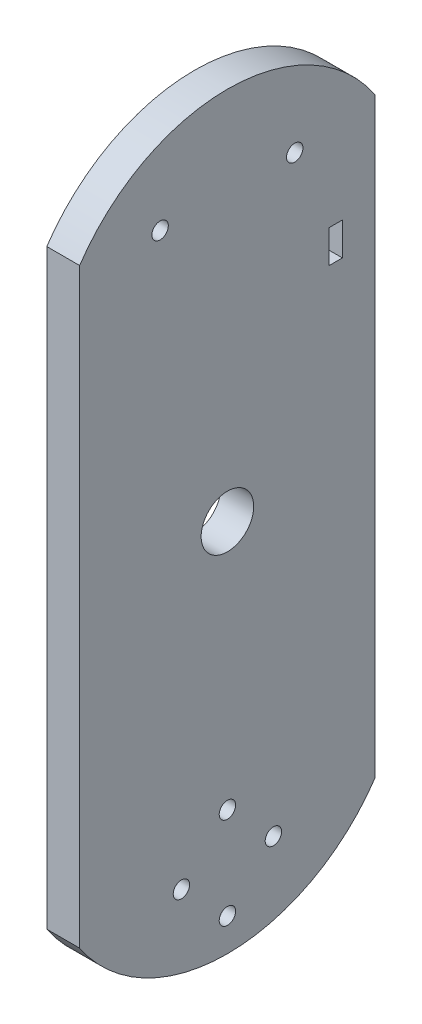
ISO-10303-21;
HEADER;
FILE_DESCRIPTION(('STEP AP214'),'2;1');
FILE_NAME('part.step','',(''),(''),'','','');
FILE_SCHEMA(('AUTOMOTIVE_DESIGN { 1 0 10303 214 1 1 1 1 }'));
ENDSEC;
DATA;
#1=APPLICATION_CONTEXT('core data for automotive mechanical design processes');
#2=APPLICATION_PROTOCOL_DEFINITION('international standard','automotive_design',2000,#1);
#3=PRODUCT_CONTEXT('',#1,'mechanical');
#4=PRODUCT('Part','Part','',(#3));
#5=PRODUCT_RELATED_PRODUCT_CATEGORY('part','',(#4));
#6=PRODUCT_DEFINITION_FORMATION('','',#4);
#7=PRODUCT_DEFINITION_CONTEXT('part definition',#1,'design');
#8=PRODUCT_DEFINITION('design','',#6,#7);
#9=PRODUCT_DEFINITION_SHAPE('','',#8);
#10=(LENGTH_UNIT() NAMED_UNIT(*) SI_UNIT(.MILLI.,.METRE.));
#11=(NAMED_UNIT(*) PLANE_ANGLE_UNIT() SI_UNIT($,.RADIAN.));
#12=(NAMED_UNIT(*) SI_UNIT($,.STERADIAN.) SOLID_ANGLE_UNIT());
#13=UNCERTAINTY_MEASURE_WITH_UNIT(LENGTH_MEASURE(1.E-05),#10,'distance_accuracy_value','');
#14=(GEOMETRIC_REPRESENTATION_CONTEXT(3) GLOBAL_UNCERTAINTY_ASSIGNED_CONTEXT((#13)) GLOBAL_UNIT_ASSIGNED_CONTEXT((#10,
#11,#12)) REPRESENTATION_CONTEXT('',''));
#15=CARTESIAN_POINT('',(0.,0.,0.));
#16=DIRECTION('',(0.,0.,1.));
#17=DIRECTION('',(1.,0.,0.));
#18=AXIS2_PLACEMENT_3D('',#15,#16,#17);
#19=CARTESIAN_POINT('',(5.,15.09375,0.));
#20=DIRECTION('',(1.,0.,0.));
#21=DIRECTION('',(0.,0.,-1.));
#22=AXIS2_PLACEMENT_3D('',#19,#20,#21);
#23=PLANE('',#22);
#24=CARTESIAN_POINT('',(5.,88.5,-10.25));
#25=DIRECTION('',(1.,0.,0.));
#26=DIRECTION('',(0.,0.,-1.));
#27=AXIS2_PLACEMENT_3D('',#24,#25,#26);
#28=CIRCLE('',#27,1.25);
#29=CARTESIAN_POINT('',(5.,88.5,-11.5));
#30=VERTEX_POINT('',#29);
#31=EDGE_CURVE('E169',#30,#30,#28,.T.);
#32=ORIENTED_EDGE('',*,*,#31,.F.);
#33=EDGE_LOOP('',(#32));
#34=FACE_BOUND('',#33,.T.);
#35=CARTESIAN_POINT('',(5.,0.,7.));
#36=DIRECTION('',(1.,0.,0.));
#37=DIRECTION('',(0.,0.,-1.));
#38=AXIS2_PLACEMENT_3D('',#35,#36,#37);
#39=CIRCLE('',#38,1.25);
#40=CARTESIAN_POINT('',(5.,0.,5.75));
#41=VERTEX_POINT('',#40);
#42=EDGE_CURVE('E185',#41,#41,#39,.T.);
#43=ORIENTED_EDGE('',*,*,#42,.F.);
#44=EDGE_LOOP('',(#43));
#45=FACE_BOUND('',#44,.T.);
#46=CARTESIAN_POINT('',(5.,0.,-7.));
#47=DIRECTION('',(1.,0.,0.));
#48=DIRECTION('',(0.,0.,-1.));
#49=AXIS2_PLACEMENT_3D('',#46,#47,#48);
#50=CIRCLE('',#49,1.25);
#51=CARTESIAN_POINT('',(5.,0.,-8.25));
#52=VERTEX_POINT('',#51);
#53=EDGE_CURVE('E201',#52,#52,#50,.T.);
#54=ORIENTED_EDGE('',*,*,#53,.F.);
#55=EDGE_LOOP('',(#54));
#56=FACE_BOUND('',#55,.T.);
#57=CARTESIAN_POINT('',(5.,15.09375,0.));
#58=DIRECTION('',(1.,0.,0.));
#59=DIRECTION('',(0.,0.,-1.));
#60=AXIS2_PLACEMENT_3D('',#57,#58,#59);
#61=CIRCLE('',#60,27.09375);
#62=CARTESIAN_POINT('',(5.,0.,22.5));
#63=VERTEX_POINT('',#62);
#64=CARTESIAN_POINT('',(5.,0.,-22.5));
#65=VERTEX_POINT('',#64);
#66=EDGE_CURVE('E217',#63,#65,#61,.T.);
#67=ORIENTED_EDGE('',*,*,#66,.T.);
#68=DIRECTION('',(0.,1.,0.));
#69=VECTOR('',#68,1.);
#70=CARTESIAN_POINT('',(5.,0.,-22.5));
#71=LINE('',#70,#69);
#72=CARTESIAN_POINT('',(5.,90.,-22.5));
#73=VERTEX_POINT('',#72);
#74=EDGE_CURVE('E221',#65,#73,#71,.T.);
#75=ORIENTED_EDGE('',*,*,#74,.T.);
#76=CARTESIAN_POINT('',(5.,74.90625,0.));
#77=DIRECTION('',(1.,0.,0.));
#78=DIRECTION('',(0.,0.,1.));
#79=AXIS2_PLACEMENT_3D('',#76,#77,#78);
#80=CIRCLE('',#79,27.09375);
#81=CARTESIAN_POINT('',(5.,90.,22.5));
#82=VERTEX_POINT('',#81);
#83=EDGE_CURVE('E225',#73,#82,#80,.T.);
#84=ORIENTED_EDGE('',*,*,#83,.T.);
#85=DIRECTION('',(0.,-1.,0.));
#86=VECTOR('',#85,1.);
#87=CARTESIAN_POINT('',(5.,0.,22.5));
#88=LINE('',#87,#86);
#89=EDGE_CURVE('E228',#82,#63,#88,.T.);
#90=ORIENTED_EDGE('',*,*,#89,.T.);
#91=EDGE_LOOP('',(#67,#75,#84,#90));
#92=FACE_BOUND('',#91,.T.);
#93=CARTESIAN_POINT('',(5.,7.,0.));
#94=DIRECTION('',(1.,0.,0.));
#95=DIRECTION('',(0.,0.,-1.));
#96=AXIS2_PLACEMENT_3D('',#93,#94,#95);
#97=CIRCLE('',#96,1.25);
#98=CARTESIAN_POINT('',(5.,7.,-1.25));
#99=VERTEX_POINT('',#98);
#100=EDGE_CURVE('E209',#99,#99,#97,.T.);
#101=ORIENTED_EDGE('',*,*,#100,.F.);
#102=EDGE_LOOP('',(#101));
#103=FACE_BOUND('',#102,.T.);
#104=CARTESIAN_POINT('',(5.,-7.,0.));
#105=DIRECTION('',(1.,0.,0.));
#106=DIRECTION('',(0.,0.,-1.));
#107=AXIS2_PLACEMENT_3D('',#104,#105,#106);
#108=CIRCLE('',#107,1.25);
#109=CARTESIAN_POINT('',(5.,-7.,-1.25));
#110=VERTEX_POINT('',#109);
#111=EDGE_CURVE('E193',#110,#110,#108,.T.);
#112=ORIENTED_EDGE('',*,*,#111,.F.);
#113=EDGE_LOOP('',(#112));
#114=FACE_BOUND('',#113,.T.);
#115=CARTESIAN_POINT('',(5.,88.5,10.25));
#116=DIRECTION('',(1.,0.,0.));
#117=DIRECTION('',(0.,0.,-1.));
#118=AXIS2_PLACEMENT_3D('',#115,#116,#117);
#119=CIRCLE('',#118,1.25);
#120=CARTESIAN_POINT('',(5.,88.5,9.00000000000001));
#121=VERTEX_POINT('',#120);
#122=EDGE_CURVE('E177',#121,#121,#119,.T.);
#123=ORIENTED_EDGE('',*,*,#122,.F.);
#124=EDGE_LOOP('',(#123));
#125=FACE_BOUND('',#124,.T.);
#126=CARTESIAN_POINT('',(5.,45.,0.));
#127=DIRECTION('',(1.,0.,0.));
#128=DIRECTION('',(0.,0.,-1.));
#129=AXIS2_PLACEMENT_3D('',#126,#127,#128);
#130=CIRCLE('',#129,4.);
#131=CARTESIAN_POINT('',(5.,45.,-4.));
#132=VERTEX_POINT('',#131);
#133=EDGE_CURVE('E161',#132,#132,#130,.T.);
#134=ORIENTED_EDGE('',*,*,#133,.F.);
#135=EDGE_LOOP('',(#134));
#136=FACE_BOUND('',#135,.T.);
#137=DIRECTION('',(0.,0.,-1.));
#138=VECTOR('',#137,1.);
#139=CARTESIAN_POINT('',(5.,71.,-15.5));
#140=LINE('',#139,#138);
#141=CARTESIAN_POINT('',(5.,71.,-15.5));
#142=VERTEX_POINT('',#141);
#143=CARTESIAN_POINT('',(5.,71.,-17.5));
#144=VERTEX_POINT('',#143);
#145=EDGE_CURVE('E120',#142,#144,#140,.T.);
#146=ORIENTED_EDGE('',*,*,#145,.F.);
#147=DIRECTION('',(0.,-1.,0.));
#148=VECTOR('',#147,1.);
#149=CARTESIAN_POINT('',(5.,76.,-15.5));
#150=LINE('',#149,#148);
#151=CARTESIAN_POINT('',(5.,76.,-15.5));
#152=VERTEX_POINT('',#151);
#153=EDGE_CURVE('E111',#152,#142,#150,.T.);
#154=ORIENTED_EDGE('',*,*,#153,.F.);
#155=DIRECTION('',(0.,0.,1.));
#156=VECTOR('',#155,1.);
#157=CARTESIAN_POINT('',(5.,76.,-15.5));
#158=LINE('',#157,#156);
#159=CARTESIAN_POINT('',(5.,76.,-17.5));
#160=VERTEX_POINT('',#159);
#161=EDGE_CURVE('E139',#160,#152,#158,.T.);
#162=ORIENTED_EDGE('',*,*,#161,.F.);
#163=DIRECTION('',(0.,1.,0.));
#164=VECTOR('',#163,1.);
#165=CARTESIAN_POINT('',(5.,76.,-17.5));
#166=LINE('',#165,#164);
#167=EDGE_CURVE('E133',#144,#160,#166,.T.);
#168=ORIENTED_EDGE('',*,*,#167,.F.);
#169=EDGE_LOOP('',(#146,#154,#162,#168));
#170=FACE_BOUND('',#169,.T.);
#171=ADVANCED_FACE('F45',(#34,#45,#56,#92,#103,#114,#125,#136,#170),#23,.T.);
#172=CARTESIAN_POINT('',(0.,15.09375,0.));
#173=DIRECTION('',(1.,0.,0.));
#174=DIRECTION('',(0.,0.,-1.));
#175=AXIS2_PLACEMENT_3D('',#172,#173,#174);
#176=PLANE('',#175);
#177=CARTESIAN_POINT('',(0.,45.,0.));
#178=DIRECTION('',(1.,0.,0.));
#179=DIRECTION('',(0.,0.,-1.));
#180=AXIS2_PLACEMENT_3D('',#177,#178,#179);
#181=CIRCLE('',#180,4.);
#182=CARTESIAN_POINT('',(0.,45.,-4.));
#183=VERTEX_POINT('',#182);
#184=EDGE_CURVE('E129',#183,#183,#181,.T.);
#185=ORIENTED_EDGE('',*,*,#184,.T.);
#186=EDGE_LOOP('',(#185));
#187=FACE_BOUND('',#186,.T.);
#188=CARTESIAN_POINT('',(0.,88.5,-10.25));
#189=DIRECTION('',(1.,0.,0.));
#190=DIRECTION('',(0.,0.,-1.));
#191=AXIS2_PLACEMENT_3D('',#188,#189,#190);
#192=CIRCLE('',#191,1.25);
#193=CARTESIAN_POINT('',(0.,88.5,-11.5));
#194=VERTEX_POINT('',#193);
#195=EDGE_CURVE('E165',#194,#194,#192,.T.);
#196=ORIENTED_EDGE('',*,*,#195,.T.);
#197=EDGE_LOOP('',(#196));
#198=FACE_BOUND('',#197,.T.);
#199=CARTESIAN_POINT('',(0.,88.5,10.25));
#200=DIRECTION('',(1.,0.,0.));
#201=DIRECTION('',(0.,0.,-1.));
#202=AXIS2_PLACEMENT_3D('',#199,#200,#201);
#203=CIRCLE('',#202,1.25);
#204=CARTESIAN_POINT('',(0.,88.5,9.00000000000001));
#205=VERTEX_POINT('',#204);
#206=EDGE_CURVE('E173',#205,#205,#203,.T.);
#207=ORIENTED_EDGE('',*,*,#206,.T.);
#208=EDGE_LOOP('',(#207));
#209=FACE_BOUND('',#208,.T.);
#210=CARTESIAN_POINT('',(0.,0.,7.));
#211=DIRECTION('',(1.,0.,0.));
#212=DIRECTION('',(0.,0.,-1.));
#213=AXIS2_PLACEMENT_3D('',#210,#211,#212);
#214=CIRCLE('',#213,1.25);
#215=CARTESIAN_POINT('',(0.,0.,5.75));
#216=VERTEX_POINT('',#215);
#217=EDGE_CURVE('E181',#216,#216,#214,.T.);
#218=ORIENTED_EDGE('',*,*,#217,.T.);
#219=EDGE_LOOP('',(#218));
#220=FACE_BOUND('',#219,.T.);
#221=CARTESIAN_POINT('',(0.,-7.,0.));
#222=DIRECTION('',(1.,0.,0.));
#223=DIRECTION('',(0.,0.,-1.));
#224=AXIS2_PLACEMENT_3D('',#221,#222,#223);
#225=CIRCLE('',#224,1.25);
#226=CARTESIAN_POINT('',(0.,-7.,-1.25));
#227=VERTEX_POINT('',#226);
#228=EDGE_CURVE('E189',#227,#227,#225,.T.);
#229=ORIENTED_EDGE('',*,*,#228,.T.);
#230=EDGE_LOOP('',(#229));
#231=FACE_BOUND('',#230,.T.);
#232=CARTESIAN_POINT('',(0.,0.,-7.));
#233=DIRECTION('',(1.,0.,0.));
#234=DIRECTION('',(0.,0.,-1.));
#235=AXIS2_PLACEMENT_3D('',#232,#233,#234);
#236=CIRCLE('',#235,1.25);
#237=CARTESIAN_POINT('',(0.,0.,-8.25));
#238=VERTEX_POINT('',#237);
#239=EDGE_CURVE('E197',#238,#238,#236,.T.);
#240=ORIENTED_EDGE('',*,*,#239,.T.);
#241=EDGE_LOOP('',(#240));
#242=FACE_BOUND('',#241,.T.);
#243=CARTESIAN_POINT('',(0.,7.,0.));
#244=DIRECTION('',(1.,0.,0.));
#245=DIRECTION('',(0.,0.,-1.));
#246=AXIS2_PLACEMENT_3D('',#243,#244,#245);
#247=CIRCLE('',#246,1.25);
#248=CARTESIAN_POINT('',(0.,7.,-1.25));
#249=VERTEX_POINT('',#248);
#250=EDGE_CURVE('E205',#249,#249,#247,.T.);
#251=ORIENTED_EDGE('',*,*,#250,.T.);
#252=EDGE_LOOP('',(#251));
#253=FACE_BOUND('',#252,.T.);
#254=CARTESIAN_POINT('',(0.,15.09375,0.));
#255=DIRECTION('',(1.,0.,0.));
#256=DIRECTION('',(0.,0.,-1.));
#257=AXIS2_PLACEMENT_3D('',#254,#255,#256);
#258=CIRCLE('',#257,27.09375);
#259=CARTESIAN_POINT('',(0.,0.,22.5));
#260=VERTEX_POINT('',#259);
#261=CARTESIAN_POINT('',(0.,0.,-22.5));
#262=VERTEX_POINT('',#261);
#263=EDGE_CURVE('E213',#260,#262,#258,.T.);
#264=ORIENTED_EDGE('',*,*,#263,.F.);
#265=DIRECTION('',(0.,-1.,0.));
#266=VECTOR('',#265,1.);
#267=CARTESIAN_POINT('',(0.,0.,22.5));
#268=LINE('',#267,#266);
#269=CARTESIAN_POINT('',(0.,90.,22.5));
#270=VERTEX_POINT('',#269);
#271=EDGE_CURVE('E222',#270,#260,#268,.T.);
#272=ORIENTED_EDGE('',*,*,#271,.F.);
#273=CARTESIAN_POINT('',(0.,74.90625,0.));
#274=DIRECTION('',(1.,0.,0.));
#275=DIRECTION('',(0.,0.,1.));
#276=AXIS2_PLACEMENT_3D('',#273,#274,#275);
#277=CIRCLE('',#276,27.09375);
#278=CARTESIAN_POINT('',(0.,90.,-22.5));
#279=VERTEX_POINT('',#278);
#280=EDGE_CURVE('E238',#279,#270,#277,.T.);
#281=ORIENTED_EDGE('',*,*,#280,.F.);
#282=DIRECTION('',(0.,1.,0.));
#283=VECTOR('',#282,1.);
#284=CARTESIAN_POINT('',(0.,0.,-22.5));
#285=LINE('',#284,#283);
#286=EDGE_CURVE('E235',#262,#279,#285,.T.);
#287=ORIENTED_EDGE('',*,*,#286,.F.);
#288=EDGE_LOOP('',(#264,#272,#281,#287));
#289=FACE_BOUND('',#288,.T.);
#290=DIRECTION('',(0.,-1.,0.));
#291=VECTOR('',#290,1.);
#292=CARTESIAN_POINT('',(0.,76.,-15.5));
#293=LINE('',#292,#291);
#294=CARTESIAN_POINT('',(0.,76.,-15.5));
#295=VERTEX_POINT('',#294);
#296=CARTESIAN_POINT('',(0.,71.,-15.5));
#297=VERTEX_POINT('',#296);
#298=EDGE_CURVE('E69',#295,#297,#293,.T.);
#299=ORIENTED_EDGE('',*,*,#298,.T.);
#300=DIRECTION('',(0.,0.,-1.));
#301=VECTOR('',#300,1.);
#302=CARTESIAN_POINT('',(0.,71.,-15.5));
#303=LINE('',#302,#301);
#304=CARTESIAN_POINT('',(0.,71.,-17.5));
#305=VERTEX_POINT('',#304);
#306=EDGE_CURVE('E127',#297,#305,#303,.T.);
#307=ORIENTED_EDGE('',*,*,#306,.T.);
#308=DIRECTION('',(0.,1.,0.));
#309=VECTOR('',#308,1.);
#310=CARTESIAN_POINT('',(0.,76.,-17.5));
#311=LINE('',#310,#309);
#312=CARTESIAN_POINT('',(0.,76.,-17.5));
#313=VERTEX_POINT('',#312);
#314=EDGE_CURVE('E148',#305,#313,#311,.T.);
#315=ORIENTED_EDGE('',*,*,#314,.T.);
#316=DIRECTION('',(0.,0.,1.));
#317=VECTOR('',#316,1.);
#318=CARTESIAN_POINT('',(0.,76.,-15.5));
#319=LINE('',#318,#317);
#320=EDGE_CURVE('E121',#313,#295,#319,.T.);
#321=ORIENTED_EDGE('',*,*,#320,.T.);
#322=EDGE_LOOP('',(#299,#307,#315,#321));
#323=FACE_BOUND('',#322,.T.);
#324=ADVANCED_FACE('F263',(#187,#198,#209,#220,#231,#242,#253,#289,#323),#176,.F.);
#325=CARTESIAN_POINT('',(5.,15.09375,0.));
#326=DIRECTION('',(-1.,0.,0.));
#327=DIRECTION('',(0.,0.,1.));
#328=AXIS2_PLACEMENT_3D('',#325,#326,#327);
#329=CYLINDRICAL_SURFACE('',#328,27.09375);
#330=ORIENTED_EDGE('',*,*,#263,.T.);
#331=DIRECTION('',(-1.,0.,0.));
#332=VECTOR('',#331,1.);
#333=CARTESIAN_POINT('',(5.,0.,-22.5));
#334=LINE('',#333,#332);
#335=EDGE_CURVE('E11',#65,#262,#334,.T.);
#336=ORIENTED_EDGE('',*,*,#335,.F.);
#337=ORIENTED_EDGE('',*,*,#66,.F.);
#338=DIRECTION('',(-1.,0.,0.));
#339=VECTOR('',#338,1.);
#340=CARTESIAN_POINT('',(5.,0.,22.5));
#341=LINE('',#340,#339);
#342=EDGE_CURVE('E231',#63,#260,#341,.T.);
#343=ORIENTED_EDGE('',*,*,#342,.T.);
#344=EDGE_LOOP('',(#330,#336,#337,#343));
#345=FACE_BOUND('',#344,.T.);
#346=ADVANCED_FACE('F47',(#345),#329,.T.);
#347=CARTESIAN_POINT('',(5.,0.,-22.5));
#348=DIRECTION('',(0.,0.,1.));
#349=DIRECTION('',(1.,0.,0.));
#350=AXIS2_PLACEMENT_3D('',#347,#348,#349);
#351=PLANE('',#350);
#352=ORIENTED_EDGE('',*,*,#286,.T.);
#353=DIRECTION('',(-1.,0.,0.));
#354=VECTOR('',#353,1.);
#355=CARTESIAN_POINT('',(5.,90.,-22.5));
#356=LINE('',#355,#354);
#357=EDGE_CURVE('E54',#73,#279,#356,.T.);
#358=ORIENTED_EDGE('',*,*,#357,.F.);
#359=ORIENTED_EDGE('',*,*,#74,.F.);
#360=ORIENTED_EDGE('',*,*,#335,.T.);
#361=EDGE_LOOP('',(#352,#358,#359,#360));
#362=FACE_BOUND('',#361,.T.);
#363=ADVANCED_FACE('F274',(#362),#351,.F.);
#364=CARTESIAN_POINT('',(5.,74.90625,0.));
#365=DIRECTION('',(-1.,0.,0.));
#366=DIRECTION('',(0.,0.,1.));
#367=AXIS2_PLACEMENT_3D('',#364,#365,#366);
#368=CYLINDRICAL_SURFACE('',#367,27.09375);
#369=ORIENTED_EDGE('',*,*,#280,.T.);
#370=DIRECTION('',(-1.,0.,0.));
#371=VECTOR('',#370,1.);
#372=CARTESIAN_POINT('',(5.,90.,22.5));
#373=LINE('',#372,#371);
#374=EDGE_CURVE('E246',#82,#270,#373,.T.);
#375=ORIENTED_EDGE('',*,*,#374,.F.);
#376=ORIENTED_EDGE('',*,*,#83,.F.);
#377=ORIENTED_EDGE('',*,*,#357,.T.);
#378=EDGE_LOOP('',(#369,#375,#376,#377));
#379=FACE_BOUND('',#378,.T.);
#380=ADVANCED_FACE('F257',(#379),#368,.T.);
#381=CARTESIAN_POINT('',(5.,0.,22.5));
#382=DIRECTION('',(0.,0.,-1.));
#383=DIRECTION('',(-1.,0.,0.));
#384=AXIS2_PLACEMENT_3D('',#381,#382,#383);
#385=PLANE('',#384);
#386=ORIENTED_EDGE('',*,*,#271,.T.);
#387=ORIENTED_EDGE('',*,*,#342,.F.);
#388=ORIENTED_EDGE('',*,*,#89,.F.);
#389=ORIENTED_EDGE('',*,*,#374,.T.);
#390=EDGE_LOOP('',(#386,#387,#388,#389));
#391=FACE_BOUND('',#390,.T.);
#392=ADVANCED_FACE('F267',(#391),#385,.F.);
#393=CARTESIAN_POINT('',(5.,7.,0.));
#394=DIRECTION('',(-1.,0.,0.));
#395=DIRECTION('',(0.,0.,1.));
#396=AXIS2_PLACEMENT_3D('',#393,#394,#395);
#397=CYLINDRICAL_SURFACE('',#396,1.25);
#398=ORIENTED_EDGE('',*,*,#100,.T.);
#399=EDGE_LOOP('',(#398));
#400=FACE_BOUND('',#399,.T.);
#401=ORIENTED_EDGE('',*,*,#250,.F.);
#402=EDGE_LOOP('',(#401));
#403=FACE_BOUND('',#402,.T.);
#404=ADVANCED_FACE('F292',(#400,#403),#397,.F.);
#405=CARTESIAN_POINT('',(5.,0.,-7.));
#406=DIRECTION('',(-1.,0.,0.));
#407=DIRECTION('',(0.,0.,1.));
#408=AXIS2_PLACEMENT_3D('',#405,#406,#407);
#409=CYLINDRICAL_SURFACE('',#408,1.25);
#410=ORIENTED_EDGE('',*,*,#53,.T.);
#411=EDGE_LOOP('',(#410));
#412=FACE_BOUND('',#411,.T.);
#413=ORIENTED_EDGE('',*,*,#239,.F.);
#414=EDGE_LOOP('',(#413));
#415=FACE_BOUND('',#414,.T.);
#416=ADVANCED_FACE('F299',(#412,#415),#409,.F.);
#417=CARTESIAN_POINT('',(5.,-7.,0.));
#418=DIRECTION('',(-1.,0.,0.));
#419=DIRECTION('',(0.,0.,1.));
#420=AXIS2_PLACEMENT_3D('',#417,#418,#419);
#421=CYLINDRICAL_SURFACE('',#420,1.25);
#422=ORIENTED_EDGE('',*,*,#111,.T.);
#423=EDGE_LOOP('',(#422));
#424=FACE_BOUND('',#423,.T.);
#425=ORIENTED_EDGE('',*,*,#228,.F.);
#426=EDGE_LOOP('',(#425));
#427=FACE_BOUND('',#426,.T.);
#428=ADVANCED_FACE('F304',(#424,#427),#421,.F.);
#429=CARTESIAN_POINT('',(5.,0.,7.));
#430=DIRECTION('',(-1.,0.,0.));
#431=DIRECTION('',(0.,0.,1.));
#432=AXIS2_PLACEMENT_3D('',#429,#430,#431);
#433=CYLINDRICAL_SURFACE('',#432,1.25);
#434=ORIENTED_EDGE('',*,*,#42,.T.);
#435=EDGE_LOOP('',(#434));
#436=FACE_BOUND('',#435,.T.);
#437=ORIENTED_EDGE('',*,*,#217,.F.);
#438=EDGE_LOOP('',(#437));
#439=FACE_BOUND('',#438,.T.);
#440=ADVANCED_FACE('F336',(#436,#439),#433,.F.);
#441=CARTESIAN_POINT('',(5.,88.5,10.25));
#442=DIRECTION('',(-1.,0.,0.));
#443=DIRECTION('',(0.,0.,1.));
#444=AXIS2_PLACEMENT_3D('',#441,#442,#443);
#445=CYLINDRICAL_SURFACE('',#444,1.25);
#446=ORIENTED_EDGE('',*,*,#122,.T.);
#447=EDGE_LOOP('',(#446));
#448=FACE_BOUND('',#447,.T.);
#449=ORIENTED_EDGE('',*,*,#206,.F.);
#450=EDGE_LOOP('',(#449));
#451=FACE_BOUND('',#450,.T.);
#452=ADVANCED_FACE('F342',(#448,#451),#445,.F.);
#453=CARTESIAN_POINT('',(5.,88.5,-10.25));
#454=DIRECTION('',(-1.,0.,0.));
#455=DIRECTION('',(0.,0.,1.));
#456=AXIS2_PLACEMENT_3D('',#453,#454,#455);
#457=CYLINDRICAL_SURFACE('',#456,1.25);
#458=ORIENTED_EDGE('',*,*,#31,.T.);
#459=EDGE_LOOP('',(#458));
#460=FACE_BOUND('',#459,.T.);
#461=ORIENTED_EDGE('',*,*,#195,.F.);
#462=EDGE_LOOP('',(#461));
#463=FACE_BOUND('',#462,.T.);
#464=ADVANCED_FACE('F320',(#460,#463),#457,.F.);
#465=CARTESIAN_POINT('',(5.,45.,0.));
#466=DIRECTION('',(-1.,0.,0.));
#467=DIRECTION('',(0.,0.,1.));
#468=AXIS2_PLACEMENT_3D('',#465,#466,#467);
#469=CYLINDRICAL_SURFACE('',#468,4.);
#470=ORIENTED_EDGE('',*,*,#133,.T.);
#471=EDGE_LOOP('',(#470));
#472=FACE_BOUND('',#471,.T.);
#473=ORIENTED_EDGE('',*,*,#184,.F.);
#474=EDGE_LOOP('',(#473));
#475=FACE_BOUND('',#474,.T.);
#476=ADVANCED_FACE('F317',(#472,#475),#469,.F.);
#477=CARTESIAN_POINT('',(5.,76.,-15.5));
#478=DIRECTION('',(0.,0.,-1.));
#479=DIRECTION('',(0.,1.,0.));
#480=AXIS2_PLACEMENT_3D('',#477,#478,#479);
#481=PLANE('',#480);
#482=ORIENTED_EDGE('',*,*,#298,.F.);
#483=DIRECTION('',(-1.,0.,0.));
#484=VECTOR('',#483,1.);
#485=CARTESIAN_POINT('',(5.,76.,-15.5));
#486=LINE('',#485,#484);
#487=EDGE_CURVE('E115',#152,#295,#486,.T.);
#488=ORIENTED_EDGE('',*,*,#487,.F.);
#489=ORIENTED_EDGE('',*,*,#153,.T.);
#490=DIRECTION('',(-1.,0.,0.));
#491=VECTOR('',#490,1.);
#492=CARTESIAN_POINT('',(5.,71.,-15.5));
#493=LINE('',#492,#491);
#494=EDGE_CURVE('E114',#142,#297,#493,.T.);
#495=ORIENTED_EDGE('',*,*,#494,.T.);
#496=EDGE_LOOP('',(#482,#488,#489,#495));
#497=FACE_BOUND('',#496,.T.);
#498=ADVANCED_FACE('F113',(#497),#481,.T.);
#499=CARTESIAN_POINT('',(5.,71.,-15.5));
#500=DIRECTION('',(0.,1.,0.));
#501=DIRECTION('',(0.,0.,1.));
#502=AXIS2_PLACEMENT_3D('',#499,#500,#501);
#503=PLANE('',#502);
#504=ORIENTED_EDGE('',*,*,#306,.F.);
#505=ORIENTED_EDGE('',*,*,#494,.F.);
#506=ORIENTED_EDGE('',*,*,#145,.T.);
#507=DIRECTION('',(-1.,0.,0.));
#508=VECTOR('',#507,1.);
#509=CARTESIAN_POINT('',(5.,71.,-17.5));
#510=LINE('',#509,#508);
#511=EDGE_CURVE('E130',#144,#305,#510,.T.);
#512=ORIENTED_EDGE('',*,*,#511,.T.);
#513=EDGE_LOOP('',(#504,#505,#506,#512));
#514=FACE_BOUND('',#513,.T.);
#515=ADVANCED_FACE('F124',(#514),#503,.T.);
#516=CARTESIAN_POINT('',(5.,76.,-17.5));
#517=DIRECTION('',(0.,0.,1.));
#518=DIRECTION('',(1.,0.,0.));
#519=AXIS2_PLACEMENT_3D('',#516,#517,#518);
#520=PLANE('',#519);
#521=ORIENTED_EDGE('',*,*,#314,.F.);
#522=ORIENTED_EDGE('',*,*,#511,.F.);
#523=ORIENTED_EDGE('',*,*,#167,.T.);
#524=DIRECTION('',(-1.,0.,0.));
#525=VECTOR('',#524,1.);
#526=CARTESIAN_POINT('',(5.,76.,-17.5));
#527=LINE('',#526,#525);
#528=EDGE_CURVE('E61',#160,#313,#527,.T.);
#529=ORIENTED_EDGE('',*,*,#528,.T.);
#530=EDGE_LOOP('',(#521,#522,#523,#529));
#531=FACE_BOUND('',#530,.T.);
#532=ADVANCED_FACE('F356',(#531),#520,.T.);
#533=CARTESIAN_POINT('',(5.,76.,-15.5));
#534=DIRECTION('',(0.,-1.,0.));
#535=DIRECTION('',(0.,0.,-1.));
#536=AXIS2_PLACEMENT_3D('',#533,#534,#535);
#537=PLANE('',#536);
#538=ORIENTED_EDGE('',*,*,#320,.F.);
#539=ORIENTED_EDGE('',*,*,#528,.F.);
#540=ORIENTED_EDGE('',*,*,#161,.T.);
#541=ORIENTED_EDGE('',*,*,#487,.T.);
#542=EDGE_LOOP('',(#538,#539,#540,#541));
#543=FACE_BOUND('',#542,.T.);
#544=ADVANCED_FACE('F359',(#543),#537,.T.);
#545=CLOSED_SHELL('',(#171,#324,#346,#363,#380,#392,#404,#416,#428,#440,#452,#464,#476,#498,
#515,#532,#544));
#546=MANIFOLD_SOLID_BREP('B2',#545);
#547=ADVANCED_BREP_SHAPE_REPRESENTATION('',(#18,#546),#14);
#548=SHAPE_DEFINITION_REPRESENTATION(#9,#547);
ENDSEC;
END-ISO-10303-21;
